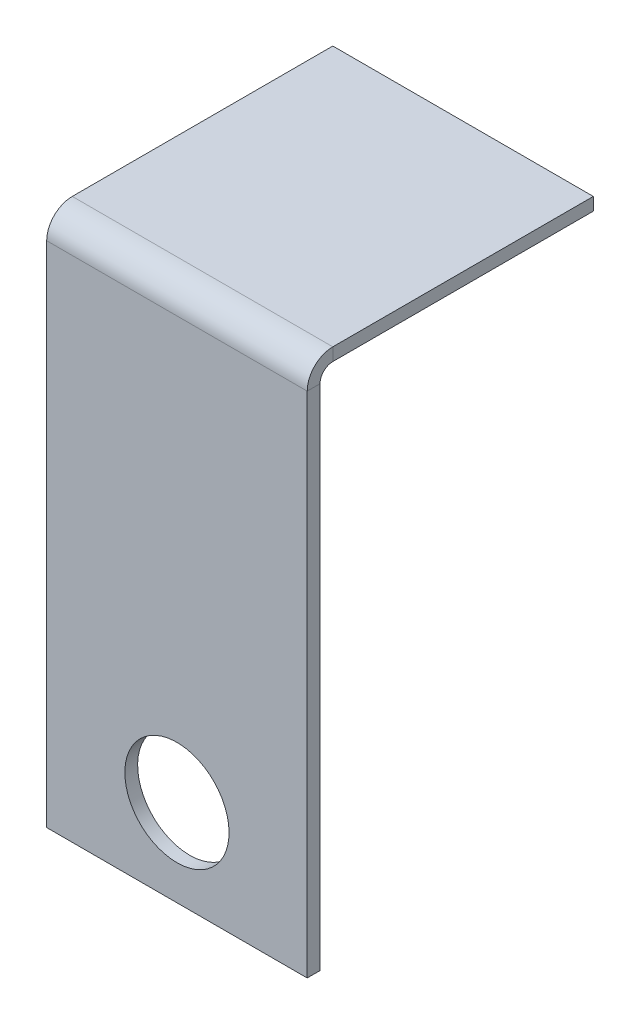
ISO-10303-21;
HEADER;
FILE_DESCRIPTION(('STEP AP214'),'2;1');
FILE_NAME('part.step','',(''),(''),'','','');
FILE_SCHEMA(('AUTOMOTIVE_DESIGN { 1 0 10303 214 1 1 1 1 }'));
ENDSEC;
DATA;
#1=APPLICATION_CONTEXT('core data for automotive mechanical design processes');
#2=APPLICATION_PROTOCOL_DEFINITION('international standard','automotive_design',2000,#1);
#3=PRODUCT_CONTEXT('',#1,'mechanical');
#4=PRODUCT('Part','Part','',(#3));
#5=PRODUCT_RELATED_PRODUCT_CATEGORY('part','',(#4));
#6=PRODUCT_DEFINITION_FORMATION('','',#4);
#7=PRODUCT_DEFINITION_CONTEXT('part definition',#1,'design');
#8=PRODUCT_DEFINITION('design','',#6,#7);
#9=PRODUCT_DEFINITION_SHAPE('','',#8);
#10=(LENGTH_UNIT() NAMED_UNIT(*) SI_UNIT(.MILLI.,.METRE.));
#11=(NAMED_UNIT(*) PLANE_ANGLE_UNIT() SI_UNIT($,.RADIAN.));
#12=(NAMED_UNIT(*) SI_UNIT($,.STERADIAN.) SOLID_ANGLE_UNIT());
#13=UNCERTAINTY_MEASURE_WITH_UNIT(LENGTH_MEASURE(1.E-05),#10,'distance_accuracy_value','');
#14=(GEOMETRIC_REPRESENTATION_CONTEXT(3) GLOBAL_UNCERTAINTY_ASSIGNED_CONTEXT((#13)) GLOBAL_UNIT_ASSIGNED_CONTEXT((#10,
#11,#12)) REPRESENTATION_CONTEXT('',''));
#15=CARTESIAN_POINT('',(0.,0.,0.));
#16=DIRECTION('',(0.,0.,1.));
#17=DIRECTION('',(1.,0.,0.));
#18=AXIS2_PLACEMENT_3D('',#15,#16,#17);
#19=CARTESIAN_POINT('',(7.5,-0.7366,-7.5));
#20=DIRECTION('',(1.,0.,0.));
#21=DIRECTION('',(0.,0.,-1.));
#22=AXIS2_PLACEMENT_3D('',#19,#20,#21);
#23=PLANE('',#22);
#24=DIRECTION('',(0.,0.,-1.));
#25=VECTOR('',#24,1.);
#26=CARTESIAN_POINT('',(7.5,0.,-7.5));
#27=LINE('',#26,#25);
#28=CARTESIAN_POINT('',(7.5,0.,7.5));
#29=VERTEX_POINT('',#28);
#30=CARTESIAN_POINT('',(7.5,0.,-7.5));
#31=VERTEX_POINT('',#30);
#32=EDGE_CURVE('E105',#29,#31,#27,.T.);
#33=ORIENTED_EDGE('',*,*,#32,.F.);
#34=DIRECTION('',(0.,1.,0.));
#35=VECTOR('',#34,1.);
#36=CARTESIAN_POINT('',(7.5,-0.7366,7.5));
#37=LINE('',#36,#35);
#38=CARTESIAN_POINT('',(7.5,-0.736599999999998,7.5));
#39=VERTEX_POINT('',#38);
#40=EDGE_CURVE('E13',#39,#29,#37,.T.);
#41=ORIENTED_EDGE('',*,*,#40,.F.);
#42=DIRECTION('',(0.,0.,-1.));
#43=VECTOR('',#42,1.);
#44=CARTESIAN_POINT('',(7.5,-0.7366,-7.5));
#45=LINE('',#44,#43);
#46=CARTESIAN_POINT('',(7.5,-0.7366,-7.5));
#47=VERTEX_POINT('',#46);
#48=EDGE_CURVE('E126',#39,#47,#45,.T.);
#49=ORIENTED_EDGE('',*,*,#48,.T.);
#50=DIRECTION('',(0.,1.,0.));
#51=VECTOR('',#50,1.);
#52=CARTESIAN_POINT('',(7.5,-0.7366,-7.5));
#53=LINE('',#52,#51);
#54=EDGE_CURVE('E60',#47,#31,#53,.T.);
#55=ORIENTED_EDGE('',*,*,#54,.T.);
#56=EDGE_LOOP('',(#33,#41,#49,#55));
#57=FACE_BOUND('',#56,.T.);
#58=ADVANCED_FACE('F57',(#57),#23,.T.);
#59=CARTESIAN_POINT('',(-7.5,-0.7366,-7.5));
#60=DIRECTION('',(-1.,0.,0.));
#61=DIRECTION('',(0.,0.,1.));
#62=AXIS2_PLACEMENT_3D('',#59,#60,#61);
#63=PLANE('',#62);
#64=DIRECTION('',(0.,0.,1.));
#65=VECTOR('',#64,1.);
#66=CARTESIAN_POINT('',(-7.5,0.,-7.5));
#67=LINE('',#66,#65);
#68=CARTESIAN_POINT('',(-7.5,0.,-7.5));
#69=VERTEX_POINT('',#68);
#70=CARTESIAN_POINT('',(-7.5,0.,7.5));
#71=VERTEX_POINT('',#70);
#72=EDGE_CURVE('E125',#69,#71,#67,.T.);
#73=ORIENTED_EDGE('',*,*,#72,.F.);
#74=DIRECTION('',(0.,1.,0.));
#75=VECTOR('',#74,1.);
#76=CARTESIAN_POINT('',(-7.5,-0.7366,-7.5));
#77=LINE('',#76,#75);
#78=CARTESIAN_POINT('',(-7.5,-0.7366,-7.5));
#79=VERTEX_POINT('',#78);
#80=EDGE_CURVE('E75',#79,#69,#77,.T.);
#81=ORIENTED_EDGE('',*,*,#80,.F.);
#82=DIRECTION('',(0.,0.,1.));
#83=VECTOR('',#82,1.);
#84=CARTESIAN_POINT('',(-7.5,-0.7366,-7.5));
#85=LINE('',#84,#83);
#86=CARTESIAN_POINT('',(-7.5,-0.736599999999998,7.5));
#87=VERTEX_POINT('',#86);
#88=EDGE_CURVE('E136',#79,#87,#85,.T.);
#89=ORIENTED_EDGE('',*,*,#88,.T.);
#90=DIRECTION('',(0.,1.,0.));
#91=VECTOR('',#90,1.);
#92=CARTESIAN_POINT('',(-7.5,-0.7366,7.5));
#93=LINE('',#92,#91);
#94=EDGE_CURVE('E66',#87,#71,#93,.T.);
#95=ORIENTED_EDGE('',*,*,#94,.T.);
#96=EDGE_LOOP('',(#73,#81,#89,#95));
#97=FACE_BOUND('',#96,.T.);
#98=ADVANCED_FACE('F233',(#97),#63,.T.);
#99=CARTESIAN_POINT('',(-7.5,-0.7366,-7.5));
#100=DIRECTION('',(0.,0.,-1.));
#101=DIRECTION('',(-1.,0.,0.));
#102=AXIS2_PLACEMENT_3D('',#99,#100,#101);
#103=PLANE('',#102);
#104=DIRECTION('',(-1.,0.,0.));
#105=VECTOR('',#104,1.);
#106=CARTESIAN_POINT('',(-7.5,0.,-7.5));
#107=LINE('',#106,#105);
#108=EDGE_CURVE('E121',#31,#69,#107,.T.);
#109=ORIENTED_EDGE('',*,*,#108,.F.);
#110=ORIENTED_EDGE('',*,*,#54,.F.);
#111=DIRECTION('',(-1.,0.,0.));
#112=VECTOR('',#111,1.);
#113=CARTESIAN_POINT('',(-7.5,-0.7366,-7.5));
#114=LINE('',#113,#112);
#115=EDGE_CURVE('E128',#47,#79,#114,.T.);
#116=ORIENTED_EDGE('',*,*,#115,.T.);
#117=ORIENTED_EDGE('',*,*,#80,.T.);
#118=EDGE_LOOP('',(#109,#110,#116,#117));
#119=FACE_BOUND('',#118,.T.);
#120=ADVANCED_FACE('F143',(#119),#103,.T.);
#121=CARTESIAN_POINT('',(0.,-0.7366,0.));
#122=DIRECTION('',(0.,1.,0.));
#123=DIRECTION('',(0.,0.,1.));
#124=AXIS2_PLACEMENT_3D('',#121,#122,#123);
#125=PLANE('',#124);
#126=ORIENTED_EDGE('',*,*,#48,.F.);
#127=DIRECTION('',(1.,0.,0.));
#128=VECTOR('',#127,1.);
#129=CARTESIAN_POINT('',(-7.5,-0.7366,7.5));
#130=LINE('',#129,#128);
#131=EDGE_CURVE('E134',#87,#39,#130,.T.);
#132=ORIENTED_EDGE('',*,*,#131,.F.);
#133=ORIENTED_EDGE('',*,*,#88,.F.);
#134=ORIENTED_EDGE('',*,*,#115,.F.);
#135=EDGE_LOOP('',(#126,#132,#133,#134));
#136=FACE_BOUND('',#135,.T.);
#137=ADVANCED_FACE('F146',(#136),#125,.F.);
#138=CARTESIAN_POINT('',(0.,0.,0.));
#139=DIRECTION('',(0.,1.,0.));
#140=DIRECTION('',(0.,0.,1.));
#141=AXIS2_PLACEMENT_3D('',#138,#139,#140);
#142=PLANE('',#141);
#143=ORIENTED_EDGE('',*,*,#32,.T.);
#144=ORIENTED_EDGE('',*,*,#108,.T.);
#145=ORIENTED_EDGE('',*,*,#72,.T.);
#146=DIRECTION('',(1.,0.,0.));
#147=VECTOR('',#146,1.);
#148=CARTESIAN_POINT('',(-7.5,0.,7.5));
#149=LINE('',#148,#147);
#150=EDGE_CURVE('E97',#71,#29,#149,.T.);
#151=ORIENTED_EDGE('',*,*,#150,.T.);
#152=EDGE_LOOP('',(#143,#144,#145,#151));
#153=FACE_BOUND('',#152,.T.);
#154=ADVANCED_FACE('F124',(#153),#142,.T.);
#155=CARTESIAN_POINT('',(7.5,-1.4732,7.5));
#156=DIRECTION('',(1.,0.,0.));
#157=DIRECTION('',(0.,0.,-1.));
#158=AXIS2_PLACEMENT_3D('',#155,#156,#157);
#159=PLANE('',#158);
#160=DIRECTION('',(0.,0.,1.));
#161=VECTOR('',#160,1.);
#162=CARTESIAN_POINT('',(7.5,-1.4732,8.9732000000001));
#163=LINE('',#162,#161);
#164=CARTESIAN_POINT('',(7.5,-1.47319999999999,8.2366));
#165=VERTEX_POINT('',#164);
#166=CARTESIAN_POINT('',(7.5,-1.47319999999999,8.9732));
#167=VERTEX_POINT('',#166);
#168=EDGE_CURVE('E153',#165,#167,#163,.T.);
#169=ORIENTED_EDGE('',*,*,#168,.F.);
#170=CARTESIAN_POINT('',(7.5,-1.4732,7.5));
#171=DIRECTION('',(-1.,0.,0.));
#172=DIRECTION('',(0.,0.,1.));
#173=AXIS2_PLACEMENT_3D('',#170,#171,#172);
#174=CIRCLE('',#173,0.7366);
#175=EDGE_CURVE('E114',#39,#165,#174,.F.);
#176=ORIENTED_EDGE('',*,*,#175,.F.);
#177=ORIENTED_EDGE('',*,*,#40,.T.);
#178=CARTESIAN_POINT('',(7.5,-1.4732,7.5));
#179=DIRECTION('',(-1.,0.,0.));
#180=DIRECTION('',(0.,0.,1.));
#181=AXIS2_PLACEMENT_3D('',#178,#179,#180);
#182=CIRCLE('',#181,1.4732);
#183=EDGE_CURVE('E93',#29,#167,#182,.F.);
#184=ORIENTED_EDGE('',*,*,#183,.T.);
#185=EDGE_LOOP('',(#169,#176,#177,#184));
#186=FACE_BOUND('',#185,.T.);
#187=ADVANCED_FACE('F111',(#186),#159,.T.);
#188=CARTESIAN_POINT('',(-7.5,-1.4732,7.5));
#189=DIRECTION('',(1.,0.,0.));
#190=DIRECTION('',(0.,0.,-1.));
#191=AXIS2_PLACEMENT_3D('',#188,#189,#190);
#192=PLANE('',#191);
#193=CARTESIAN_POINT('',(-7.5,-1.4732,7.5));
#194=DIRECTION('',(-1.,0.,0.));
#195=DIRECTION('',(0.,0.,1.));
#196=AXIS2_PLACEMENT_3D('',#193,#194,#195);
#197=CIRCLE('',#196,0.7366);
#198=CARTESIAN_POINT('',(-7.5,-1.47319999999999,8.2366));
#199=VERTEX_POINT('',#198);
#200=EDGE_CURVE('E148',#199,#87,#197,.T.);
#201=ORIENTED_EDGE('',*,*,#200,.F.);
#202=DIRECTION('',(0.,0.,1.));
#203=VECTOR('',#202,1.);
#204=CARTESIAN_POINT('',(-7.5,-1.4732,8.2366));
#205=LINE('',#204,#203);
#206=CARTESIAN_POINT('',(-7.5,-1.4732,8.9732));
#207=VERTEX_POINT('',#206);
#208=EDGE_CURVE('E158',#199,#207,#205,.T.);
#209=ORIENTED_EDGE('',*,*,#208,.T.);
#210=CARTESIAN_POINT('',(-7.5,-1.4732,7.5));
#211=DIRECTION('',(-1.,0.,0.));
#212=DIRECTION('',(0.,0.,1.));
#213=AXIS2_PLACEMENT_3D('',#210,#211,#212);
#214=CIRCLE('',#213,1.4732);
#215=EDGE_CURVE('E106',#207,#71,#214,.T.);
#216=ORIENTED_EDGE('',*,*,#215,.T.);
#217=ORIENTED_EDGE('',*,*,#94,.F.);
#218=EDGE_LOOP('',(#201,#209,#216,#217));
#219=FACE_BOUND('',#218,.T.);
#220=ADVANCED_FACE('F216',(#219),#192,.F.);
#221=CARTESIAN_POINT('',(-7.5,-1.4732,7.5));
#222=DIRECTION('',(-1.,0.,0.));
#223=DIRECTION('',(0.,0.,1.));
#224=AXIS2_PLACEMENT_3D('',#221,#222,#223);
#225=CYLINDRICAL_SURFACE('',#224,1.4732);
#226=ORIENTED_EDGE('',*,*,#150,.F.);
#227=ORIENTED_EDGE('',*,*,#215,.F.);
#228=DIRECTION('',(-1.,0.,0.));
#229=VECTOR('',#228,1.);
#230=CARTESIAN_POINT('',(0.,-1.4732,8.9732));
#231=LINE('',#230,#229);
#232=EDGE_CURVE('E101',#167,#207,#231,.T.);
#233=ORIENTED_EDGE('',*,*,#232,.F.);
#234=ORIENTED_EDGE('',*,*,#183,.F.);
#235=EDGE_LOOP('',(#226,#227,#233,#234));
#236=FACE_BOUND('',#235,.T.);
#237=ADVANCED_FACE('F94',(#236),#225,.T.);
#238=CARTESIAN_POINT('',(-7.5,-1.4732,7.5));
#239=DIRECTION('',(-1.,0.,0.));
#240=DIRECTION('',(0.,0.,1.));
#241=AXIS2_PLACEMENT_3D('',#238,#239,#240);
#242=CYLINDRICAL_SURFACE('',#241,0.7366);
#243=ORIENTED_EDGE('',*,*,#131,.T.);
#244=ORIENTED_EDGE('',*,*,#175,.T.);
#245=DIRECTION('',(1.,0.,0.));
#246=VECTOR('',#245,1.);
#247=CARTESIAN_POINT('',(7.5,-1.4732,8.2366));
#248=LINE('',#247,#246);
#249=EDGE_CURVE('E155',#165,#199,#248,.F.);
#250=ORIENTED_EDGE('',*,*,#249,.T.);
#251=ORIENTED_EDGE('',*,*,#200,.T.);
#252=EDGE_LOOP('',(#243,#244,#250,#251));
#253=FACE_BOUND('',#252,.T.);
#254=ADVANCED_FACE('F232',(#253),#242,.F.);
#255=CARTESIAN_POINT('',(-7.5,-0.736599999999997,8.97319999999999));
#256=DIRECTION('',(-1.,0.,0.));
#257=DIRECTION('',(0.,0.,1.));
#258=AXIS2_PLACEMENT_3D('',#255,#256,#257);
#259=PLANE('',#258);
#260=DIRECTION('',(0.,1.,0.));
#261=VECTOR('',#260,1.);
#262=CARTESIAN_POINT('',(-7.5,-0.736599999999997,8.97319999999999));
#263=LINE('',#262,#261);
#264=CARTESIAN_POINT('',(-7.5,-30.7366,8.9732000000001));
#265=VERTEX_POINT('',#264);
#266=EDGE_CURVE('E183',#265,#207,#263,.T.);
#267=ORIENTED_EDGE('',*,*,#266,.T.);
#268=ORIENTED_EDGE('',*,*,#208,.F.);
#269=DIRECTION('',(0.,-1.,0.));
#270=VECTOR('',#269,1.);
#271=CARTESIAN_POINT('',(-7.5,0.,8.23659999999999));
#272=LINE('',#271,#270);
#273=CARTESIAN_POINT('',(-7.5,-30.7366,8.2366000000001));
#274=VERTEX_POINT('',#273);
#275=EDGE_CURVE('E174',#274,#199,#272,.F.);
#276=ORIENTED_EDGE('',*,*,#275,.F.);
#277=DIRECTION('',(0.,0.,-1.));
#278=VECTOR('',#277,1.);
#279=CARTESIAN_POINT('',(-7.5,-30.7366,8.9732000000001));
#280=LINE('',#279,#278);
#281=EDGE_CURVE('E150',#265,#274,#280,.T.);
#282=ORIENTED_EDGE('',*,*,#281,.F.);
#283=EDGE_LOOP('',(#267,#268,#276,#282));
#284=FACE_BOUND('',#283,.T.);
#285=ADVANCED_FACE('F210',(#284),#259,.T.);
#286=CARTESIAN_POINT('',(7.5,-30.7366,8.9732000000001));
#287=DIRECTION('',(1.,0.,0.));
#288=DIRECTION('',(0.,1.,0.));
#289=AXIS2_PLACEMENT_3D('',#286,#287,#288);
#290=PLANE('',#289);
#291=DIRECTION('',(0.,1.,0.));
#292=VECTOR('',#291,1.);
#293=CARTESIAN_POINT('',(7.5,0.,8.23659999999999));
#294=LINE('',#293,#292);
#295=CARTESIAN_POINT('',(7.5,-30.7366,8.2366000000001));
#296=VERTEX_POINT('',#295);
#297=EDGE_CURVE('E168',#165,#296,#294,.F.);
#298=ORIENTED_EDGE('',*,*,#297,.F.);
#299=ORIENTED_EDGE('',*,*,#168,.T.);
#300=DIRECTION('',(0.,-1.,0.));
#301=VECTOR('',#300,1.);
#302=CARTESIAN_POINT('',(7.5,-30.7366,8.9732000000001));
#303=LINE('',#302,#301);
#304=CARTESIAN_POINT('',(7.5,-30.7366,8.9732000000001));
#305=VERTEX_POINT('',#304);
#306=EDGE_CURVE('E177',#167,#305,#303,.T.);
#307=ORIENTED_EDGE('',*,*,#306,.T.);
#308=DIRECTION('',(0.,0.,-1.));
#309=VECTOR('',#308,1.);
#310=CARTESIAN_POINT('',(7.5,-30.7366,8.9732000000001));
#311=LINE('',#310,#309);
#312=EDGE_CURVE('E186',#305,#296,#311,.T.);
#313=ORIENTED_EDGE('',*,*,#312,.T.);
#314=EDGE_LOOP('',(#298,#299,#307,#313));
#315=FACE_BOUND('',#314,.T.);
#316=ADVANCED_FACE('F224',(#315),#290,.T.);
#317=CARTESIAN_POINT('',(0.,0.,8.97319999999999));
#318=DIRECTION('',(0.,0.,1.));
#319=DIRECTION('',(0.,-1.,0.));
#320=AXIS2_PLACEMENT_3D('',#317,#318,#319);
#321=PLANE('',#320);
#322=CARTESIAN_POINT('',(0.,-25.7366,8.97320000000008));
#323=DIRECTION('',(0.,0.,1.));
#324=DIRECTION('',(0.,-1.,0.));
#325=AXIS2_PLACEMENT_3D('',#322,#323,#324);
#326=CIRCLE('',#325,3.);
#327=CARTESIAN_POINT('',(0.,-28.7366,8.97320000000009));
#328=VERTEX_POINT('',#327);
#329=EDGE_CURVE('E165',#328,#328,#326,.F.);
#330=ORIENTED_EDGE('',*,*,#329,.T.);
#331=EDGE_LOOP('',(#330));
#332=FACE_BOUND('',#331,.T.);
#333=ORIENTED_EDGE('',*,*,#306,.F.);
#334=ORIENTED_EDGE('',*,*,#232,.T.);
#335=ORIENTED_EDGE('',*,*,#266,.F.);
#336=DIRECTION('',(-1.,0.,0.));
#337=VECTOR('',#336,1.);
#338=CARTESIAN_POINT('',(-7.5,-30.7366,8.9732000000001));
#339=LINE('',#338,#337);
#340=EDGE_CURVE('E180',#305,#265,#339,.T.);
#341=ORIENTED_EDGE('',*,*,#340,.F.);
#342=EDGE_LOOP('',(#333,#334,#335,#341));
#343=FACE_BOUND('',#342,.T.);
#344=ADVANCED_FACE('F221',(#332,#343),#321,.T.);
#345=CARTESIAN_POINT('',(0.,0.,8.23659999999999));
#346=DIRECTION('',(0.,0.,1.));
#347=DIRECTION('',(0.,-1.,0.));
#348=AXIS2_PLACEMENT_3D('',#345,#346,#347);
#349=PLANE('',#348);
#350=CARTESIAN_POINT('',(0.,-25.7366,8.23660000000008));
#351=DIRECTION('',(0.,0.,1.));
#352=DIRECTION('',(0.,-1.,0.));
#353=AXIS2_PLACEMENT_3D('',#350,#351,#352);
#354=CIRCLE('',#353,3.);
#355=CARTESIAN_POINT('',(0.,-28.7366,8.23660000000009));
#356=VERTEX_POINT('',#355);
#357=EDGE_CURVE('E162',#356,#356,#354,.F.);
#358=ORIENTED_EDGE('',*,*,#357,.F.);
#359=EDGE_LOOP('',(#358));
#360=FACE_BOUND('',#359,.T.);
#361=ORIENTED_EDGE('',*,*,#249,.F.);
#362=ORIENTED_EDGE('',*,*,#297,.T.);
#363=DIRECTION('',(1.,0.,0.));
#364=VECTOR('',#363,1.);
#365=CARTESIAN_POINT('',(0.,-30.7366,8.2366000000001));
#366=LINE('',#365,#364);
#367=EDGE_CURVE('E171',#296,#274,#366,.F.);
#368=ORIENTED_EDGE('',*,*,#367,.T.);
#369=ORIENTED_EDGE('',*,*,#275,.T.);
#370=EDGE_LOOP('',(#361,#362,#368,#369));
#371=FACE_BOUND('',#370,.T.);
#372=ADVANCED_FACE('F206',(#360,#371),#349,.F.);
#373=CARTESIAN_POINT('',(-7.5,-30.7366,8.9732000000001));
#374=DIRECTION('',(0.,-1.,0.));
#375=DIRECTION('',(0.,0.,-1.));
#376=AXIS2_PLACEMENT_3D('',#373,#374,#375);
#377=PLANE('',#376);
#378=ORIENTED_EDGE('',*,*,#367,.F.);
#379=ORIENTED_EDGE('',*,*,#312,.F.);
#380=ORIENTED_EDGE('',*,*,#340,.T.);
#381=ORIENTED_EDGE('',*,*,#281,.T.);
#382=EDGE_LOOP('',(#378,#379,#380,#381));
#383=FACE_BOUND('',#382,.T.);
#384=ADVANCED_FACE('F194',(#383),#377,.T.);
#385=CARTESIAN_POINT('',(0.,-25.7366,8.97320000000008));
#386=DIRECTION('',(0.,0.,-1.));
#387=DIRECTION('',(0.,1.,0.));
#388=AXIS2_PLACEMENT_3D('',#385,#386,#387);
#389=CYLINDRICAL_SURFACE('',#388,3.);
#390=ORIENTED_EDGE('',*,*,#329,.F.);
#391=EDGE_LOOP('',(#390));
#392=FACE_BOUND('',#391,.T.);
#393=ORIENTED_EDGE('',*,*,#357,.T.);
#394=EDGE_LOOP('',(#393));
#395=FACE_BOUND('',#394,.T.);
#396=ADVANCED_FACE('F257',(#392,#395),#389,.F.);
#397=CLOSED_SHELL('',(#58,#98,#120,#137,#154,#187,#220,#237,#254,#285,#316,#344,#372,#384,#396));
#398=MANIFOLD_SOLID_BREP('B2',#397);
#399=ADVANCED_BREP_SHAPE_REPRESENTATION('',(#18,#398),#14);
#400=SHAPE_DEFINITION_REPRESENTATION(#9,#399);
ENDSEC;
END-ISO-10303-21;
